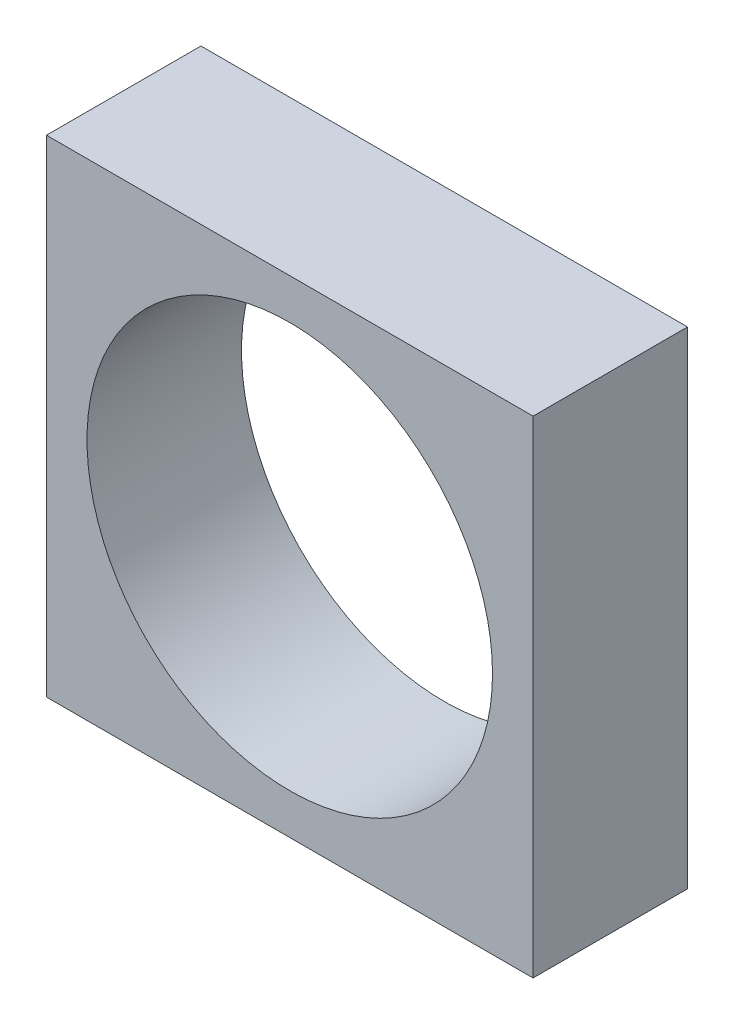
ISO-10303-21;
HEADER;
FILE_DESCRIPTION(('STEP AP214'),'2;1');
FILE_NAME('part.step','',(''),(''),'','','');
FILE_SCHEMA(('AUTOMOTIVE_DESIGN { 1 0 10303 214 1 1 1 1 }'));
ENDSEC;
DATA;
#1=APPLICATION_CONTEXT('core data for automotive mechanical design processes');
#2=APPLICATION_PROTOCOL_DEFINITION('international standard','automotive_design',2000,#1);
#3=PRODUCT_CONTEXT('',#1,'mechanical');
#4=PRODUCT('Part','Part','',(#3));
#5=PRODUCT_RELATED_PRODUCT_CATEGORY('part','',(#4));
#6=PRODUCT_DEFINITION_FORMATION('','',#4);
#7=PRODUCT_DEFINITION_CONTEXT('part definition',#1,'design');
#8=PRODUCT_DEFINITION('design','',#6,#7);
#9=PRODUCT_DEFINITION_SHAPE('','',#8);
#10=(LENGTH_UNIT() NAMED_UNIT(*) SI_UNIT(.MILLI.,.METRE.));
#11=(NAMED_UNIT(*) PLANE_ANGLE_UNIT() SI_UNIT($,.RADIAN.));
#12=(NAMED_UNIT(*) SI_UNIT($,.STERADIAN.) SOLID_ANGLE_UNIT());
#13=UNCERTAINTY_MEASURE_WITH_UNIT(LENGTH_MEASURE(1.E-05),#10,'distance_accuracy_value','');
#14=(GEOMETRIC_REPRESENTATION_CONTEXT(3) GLOBAL_UNCERTAINTY_ASSIGNED_CONTEXT((#13)) GLOBAL_UNIT_ASSIGNED_CONTEXT((#10,
#11,#12)) REPRESENTATION_CONTEXT('',''));
#15=CARTESIAN_POINT('',(0.,0.,0.));
#16=DIRECTION('',(0.,0.,1.));
#17=DIRECTION('',(1.,0.,0.));
#18=AXIS2_PLACEMENT_3D('',#15,#16,#17);
#19=CARTESIAN_POINT('',(0.,0.,19.05));
#20=DIRECTION('',(1.,0.,0.));
#21=DIRECTION('',(0.,0.,-1.));
#22=AXIS2_PLACEMENT_3D('',#19,#20,#21);
#23=PLANE('',#22);
#24=DIRECTION('',(0.,-1.,0.));
#25=VECTOR('',#24,1.);
#26=CARTESIAN_POINT('',(0.,0.,0.));
#27=LINE('',#26,#25);
#28=CARTESIAN_POINT('',(0.,60.,0.));
#29=VERTEX_POINT('',#28);
#30=CARTESIAN_POINT('',(0.,0.,0.));
#31=VERTEX_POINT('',#30);
#32=EDGE_CURVE('E95',#29,#31,#27,.T.);
#33=ORIENTED_EDGE('',*,*,#32,.T.);
#34=DIRECTION('',(0.,0.,-1.));
#35=VECTOR('',#34,1.);
#36=CARTESIAN_POINT('',(0.,0.,19.05));
#37=LINE('',#36,#35);
#38=CARTESIAN_POINT('',(0.,0.,19.05));
#39=VERTEX_POINT('',#38);
#40=EDGE_CURVE('E11',#39,#31,#37,.T.);
#41=ORIENTED_EDGE('',*,*,#40,.F.);
#42=DIRECTION('',(0.,-1.,0.));
#43=VECTOR('',#42,1.);
#44=CARTESIAN_POINT('',(0.,0.,19.05));
#45=LINE('',#44,#43);
#46=CARTESIAN_POINT('',(0.,60.,19.05));
#47=VERTEX_POINT('',#46);
#48=EDGE_CURVE('E83',#47,#39,#45,.T.);
#49=ORIENTED_EDGE('',*,*,#48,.F.);
#50=DIRECTION('',(0.,0.,-1.));
#51=VECTOR('',#50,1.);
#52=CARTESIAN_POINT('',(0.,60.,19.05));
#53=LINE('',#52,#51);
#54=EDGE_CURVE('E91',#47,#29,#53,.T.);
#55=ORIENTED_EDGE('',*,*,#54,.T.);
#56=EDGE_LOOP('',(#33,#41,#49,#55));
#57=FACE_BOUND('',#56,.T.);
#58=ADVANCED_FACE('F32',(#57),#23,.F.);
#59=CARTESIAN_POINT('',(0.,0.,19.05));
#60=DIRECTION('',(0.,1.,0.));
#61=DIRECTION('',(0.,0.,1.));
#62=AXIS2_PLACEMENT_3D('',#59,#60,#61);
#63=PLANE('',#62);
#64=DIRECTION('',(1.,0.,0.));
#65=VECTOR('',#64,1.);
#66=CARTESIAN_POINT('',(0.,0.,0.));
#67=LINE('',#66,#65);
#68=CARTESIAN_POINT('',(60.,0.,0.));
#69=VERTEX_POINT('',#68);
#70=EDGE_CURVE('E87',#31,#69,#67,.T.);
#71=ORIENTED_EDGE('',*,*,#70,.T.);
#72=DIRECTION('',(0.,0.,-1.));
#73=VECTOR('',#72,1.);
#74=CARTESIAN_POINT('',(60.,0.,19.05));
#75=LINE('',#74,#73);
#76=CARTESIAN_POINT('',(60.,0.,19.05));
#77=VERTEX_POINT('',#76);
#78=EDGE_CURVE('E40',#77,#69,#75,.T.);
#79=ORIENTED_EDGE('',*,*,#78,.F.);
#80=DIRECTION('',(1.,0.,0.));
#81=VECTOR('',#80,1.);
#82=CARTESIAN_POINT('',(0.,0.,19.05));
#83=LINE('',#82,#81);
#84=EDGE_CURVE('E78',#39,#77,#83,.T.);
#85=ORIENTED_EDGE('',*,*,#84,.F.);
#86=ORIENTED_EDGE('',*,*,#40,.T.);
#87=EDGE_LOOP('',(#71,#79,#85,#86));
#88=FACE_BOUND('',#87,.T.);
#89=ADVANCED_FACE('F86',(#88),#63,.F.);
#90=CARTESIAN_POINT('',(60.,0.,19.05));
#91=DIRECTION('',(-1.,0.,0.));
#92=DIRECTION('',(0.,0.,1.));
#93=AXIS2_PLACEMENT_3D('',#90,#91,#92);
#94=PLANE('',#93);
#95=DIRECTION('',(0.,1.,0.));
#96=VECTOR('',#95,1.);
#97=CARTESIAN_POINT('',(60.,0.,0.));
#98=LINE('',#97,#96);
#99=CARTESIAN_POINT('',(60.,60.,0.));
#100=VERTEX_POINT('',#99);
#101=EDGE_CURVE('E65',#69,#100,#98,.T.);
#102=ORIENTED_EDGE('',*,*,#101,.T.);
#103=DIRECTION('',(0.,0.,-1.));
#104=VECTOR('',#103,1.);
#105=CARTESIAN_POINT('',(60.,60.,19.05));
#106=LINE('',#105,#104);
#107=CARTESIAN_POINT('',(60.,60.,19.05));
#108=VERTEX_POINT('',#107);
#109=EDGE_CURVE('E88',#108,#100,#106,.T.);
#110=ORIENTED_EDGE('',*,*,#109,.F.);
#111=DIRECTION('',(0.,1.,0.));
#112=VECTOR('',#111,1.);
#113=CARTESIAN_POINT('',(60.,0.,19.05));
#114=LINE('',#113,#112);
#115=EDGE_CURVE('E81',#77,#108,#114,.T.);
#116=ORIENTED_EDGE('',*,*,#115,.F.);
#117=ORIENTED_EDGE('',*,*,#78,.T.);
#118=EDGE_LOOP('',(#102,#110,#116,#117));
#119=FACE_BOUND('',#118,.T.);
#120=ADVANCED_FACE('F89',(#119),#94,.F.);
#121=CARTESIAN_POINT('',(0.,60.,19.05));
#122=DIRECTION('',(0.,-1.,0.));
#123=DIRECTION('',(0.,0.,-1.));
#124=AXIS2_PLACEMENT_3D('',#121,#122,#123);
#125=PLANE('',#124);
#126=DIRECTION('',(-1.,0.,0.));
#127=VECTOR('',#126,1.);
#128=CARTESIAN_POINT('',(0.,60.,0.));
#129=LINE('',#128,#127);
#130=EDGE_CURVE('E71',#100,#29,#129,.T.);
#131=ORIENTED_EDGE('',*,*,#130,.T.);
#132=ORIENTED_EDGE('',*,*,#54,.F.);
#133=DIRECTION('',(-1.,0.,0.));
#134=VECTOR('',#133,1.);
#135=CARTESIAN_POINT('',(0.,60.,19.05));
#136=LINE('',#135,#134);
#137=EDGE_CURVE('E48',#108,#47,#136,.T.);
#138=ORIENTED_EDGE('',*,*,#137,.F.);
#139=ORIENTED_EDGE('',*,*,#109,.T.);
#140=EDGE_LOOP('',(#131,#132,#138,#139));
#141=FACE_BOUND('',#140,.T.);
#142=ADVANCED_FACE('F103',(#141),#125,.F.);
#143=CARTESIAN_POINT('',(0.,60.,19.05));
#144=DIRECTION('',(0.,0.,-1.));
#145=DIRECTION('',(-1.,0.,0.));
#146=AXIS2_PLACEMENT_3D('',#143,#144,#145);
#147=PLANE('',#146);
#148=CARTESIAN_POINT('',(30.,30.,19.05));
#149=DIRECTION('',(0.,0.,1.));
#150=DIRECTION('',(1.,0.,0.));
#151=AXIS2_PLACEMENT_3D('',#148,#149,#150);
#152=CIRCLE('',#151,25.);
#153=CARTESIAN_POINT('',(55.,30.,19.05));
#154=VERTEX_POINT('',#153);
#155=EDGE_CURVE('E109',#154,#154,#152,.T.);
#156=ORIENTED_EDGE('',*,*,#155,.F.);
#157=EDGE_LOOP('',(#156));
#158=FACE_BOUND('',#157,.T.);
#159=ORIENTED_EDGE('',*,*,#48,.T.);
#160=ORIENTED_EDGE('',*,*,#84,.T.);
#161=ORIENTED_EDGE('',*,*,#115,.T.);
#162=ORIENTED_EDGE('',*,*,#137,.T.);
#163=EDGE_LOOP('',(#159,#160,#161,#162));
#164=FACE_BOUND('',#163,.T.);
#165=ADVANCED_FACE('F79',(#158,#164),#147,.F.);
#166=CARTESIAN_POINT('',(0.,60.,0.));
#167=DIRECTION('',(0.,0.,-1.));
#168=DIRECTION('',(-1.,0.,0.));
#169=AXIS2_PLACEMENT_3D('',#166,#167,#168);
#170=PLANE('',#169);
#171=CARTESIAN_POINT('',(30.,30.,0.));
#172=DIRECTION('',(0.,0.,1.));
#173=DIRECTION('',(1.,0.,0.));
#174=AXIS2_PLACEMENT_3D('',#171,#172,#173);
#175=CIRCLE('',#174,25.);
#176=CARTESIAN_POINT('',(55.,30.,0.));
#177=VERTEX_POINT('',#176);
#178=EDGE_CURVE('E98',#177,#177,#175,.T.);
#179=ORIENTED_EDGE('',*,*,#178,.T.);
#180=EDGE_LOOP('',(#179));
#181=FACE_BOUND('',#180,.T.);
#182=ORIENTED_EDGE('',*,*,#32,.F.);
#183=ORIENTED_EDGE('',*,*,#130,.F.);
#184=ORIENTED_EDGE('',*,*,#101,.F.);
#185=ORIENTED_EDGE('',*,*,#70,.F.);
#186=EDGE_LOOP('',(#182,#183,#184,#185));
#187=FACE_BOUND('',#186,.T.);
#188=ADVANCED_FACE('F106',(#181,#187),#170,.T.);
#189=CARTESIAN_POINT('',(30.,30.,0.));
#190=DIRECTION('',(0.,0.,1.));
#191=DIRECTION('',(1.,0.,0.));
#192=AXIS2_PLACEMENT_3D('',#189,#190,#191);
#193=CYLINDRICAL_SURFACE('',#192,25.);
#194=CARTESIAN_POINT('',(55.,30.,0.));
#195=CARTESIAN_POINT('',(55.,30.,0.1984375));
#196=CARTESIAN_POINT('',(55.,30.,0.396875));
#197=CARTESIAN_POINT('',(55.,30.,0.79375));
#198=CARTESIAN_POINT('',(55.,30.,0.9921875));
#199=CARTESIAN_POINT('',(55.,30.,1.3890625));
#200=CARTESIAN_POINT('',(55.,30.,1.5875));
#201=CARTESIAN_POINT('',(55.,30.,1.984375));
#202=CARTESIAN_POINT('',(55.,30.,2.1828125));
#203=CARTESIAN_POINT('',(55.,30.,2.5796875));
#204=CARTESIAN_POINT('',(55.,30.,2.778125));
#205=CARTESIAN_POINT('',(55.,30.,3.175));
#206=CARTESIAN_POINT('',(55.,30.,3.3734375));
#207=CARTESIAN_POINT('',(55.,30.,3.7703125));
#208=CARTESIAN_POINT('',(55.,30.,3.96875));
#209=CARTESIAN_POINT('',(55.,30.,4.365625));
#210=CARTESIAN_POINT('',(55.,30.,4.5640625));
#211=CARTESIAN_POINT('',(55.,30.,4.9609375));
#212=CARTESIAN_POINT('',(55.,30.,5.159375));
#213=CARTESIAN_POINT('',(55.,30.,5.55625));
#214=CARTESIAN_POINT('',(55.,30.,5.7546875));
#215=CARTESIAN_POINT('',(55.,30.,6.1515625));
#216=CARTESIAN_POINT('',(55.,30.,6.35));
#217=CARTESIAN_POINT('',(55.,30.,6.746875));
#218=CARTESIAN_POINT('',(55.,30.,6.9453125));
#219=CARTESIAN_POINT('',(55.,30.,7.3421875));
#220=CARTESIAN_POINT('',(55.,30.,7.540625));
#221=CARTESIAN_POINT('',(55.,30.,7.9375));
#222=CARTESIAN_POINT('',(55.,30.,8.1359375));
#223=CARTESIAN_POINT('',(55.,30.,8.5328125));
#224=CARTESIAN_POINT('',(55.,30.,8.73125));
#225=CARTESIAN_POINT('',(55.,30.,9.128125));
#226=CARTESIAN_POINT('',(55.,30.,9.3265625));
#227=CARTESIAN_POINT('',(55.,30.,9.7234375));
#228=CARTESIAN_POINT('',(55.,30.,9.921875));
#229=CARTESIAN_POINT('',(55.,30.,10.31875));
#230=CARTESIAN_POINT('',(55.,30.,10.5171875));
#231=CARTESIAN_POINT('',(55.,30.,10.9140625));
#232=CARTESIAN_POINT('',(55.,30.,11.1125));
#233=CARTESIAN_POINT('',(55.,30.,11.509375));
#234=CARTESIAN_POINT('',(55.,30.,11.7078125));
#235=CARTESIAN_POINT('',(55.,30.,12.1046875));
#236=CARTESIAN_POINT('',(55.,30.,12.303125));
#237=CARTESIAN_POINT('',(55.,30.,12.7));
#238=CARTESIAN_POINT('',(55.,30.,12.8984375));
#239=CARTESIAN_POINT('',(55.,30.,13.2953125));
#240=CARTESIAN_POINT('',(55.,30.,13.49375));
#241=CARTESIAN_POINT('',(55.,30.,13.890625));
#242=CARTESIAN_POINT('',(55.,30.,14.0890625));
#243=CARTESIAN_POINT('',(55.,30.,14.4859375));
#244=CARTESIAN_POINT('',(55.,30.,14.684375));
#245=CARTESIAN_POINT('',(55.,30.,15.08125));
#246=CARTESIAN_POINT('',(55.,30.,15.2796875));
#247=CARTESIAN_POINT('',(55.,30.,15.6765625));
#248=CARTESIAN_POINT('',(55.,30.,15.875));
#249=CARTESIAN_POINT('',(55.,30.,16.271875));
#250=CARTESIAN_POINT('',(55.,30.,16.4703125));
#251=CARTESIAN_POINT('',(55.,30.,16.8671875));
#252=CARTESIAN_POINT('',(55.,30.,17.065625));
#253=CARTESIAN_POINT('',(55.,30.,17.4625));
#254=CARTESIAN_POINT('',(55.,30.,17.6609375));
#255=CARTESIAN_POINT('',(55.,30.,18.0578125));
#256=CARTESIAN_POINT('',(55.,30.,18.25625));
#257=CARTESIAN_POINT('',(55.,30.,18.653125));
#258=CARTESIAN_POINT('',(55.,30.,18.8515625));
#259=CARTESIAN_POINT('',(55.,30.,19.05));
#260=B_SPLINE_CURVE_WITH_KNOTS('',3,(#194,#195,#196,#197,#198,#199,#200,#201,#202,#203,#204,
#205,#206,#207,#208,#209,#210,#211,#212,#213,#214,#215,#216,#217,#218,#219,#220,#221,#222,#223,
#224,#225,#226,#227,#228,#229,#230,#231,#232,#233,#234,#235,#236,#237,#238,#239,#240,#241,#242,
#243,#244,#245,#246,#247,#248,#249,#250,#251,#252,#253,#254,#255,#256,#257,#258,#259),
.UNSPECIFIED.,.F.,.F.,(4,2,2,2,2,2,2,2,2,2,2,2,2,2,2,2,2,2,2,2,2,2,2,2,2,2,2,2,2,2,2,2,4),(0.,
0.5953125,1.190625,1.7859375,2.38125,2.9765625,3.571875,4.1671875,4.7625,5.3578125,5.953125,
6.5484375,7.14375,7.7390625,8.334375,8.9296875,9.525,10.1203125,10.715625,11.3109375,11.90625,
12.5015625,13.096875,13.6921875,14.2875,14.8828125,15.478125,16.0734375,16.66875,17.2640625,
17.859375,18.4546875,19.05),.UNSPECIFIED.);
#261=EDGE_CURVE('BSEAM116',#177,#154,#260,.T.);
#262=ORIENTED_EDGE('',*,*,#178,.F.);
#263=ORIENTED_EDGE('',*,*,#155,.T.);
#264=ORIENTED_EDGE('',*,*,#261,.T.);
#265=ORIENTED_EDGE('',*,*,#261,.F.);
#266=EDGE_LOOP('',(#262,#264,#263,#265));
#267=FACE_BOUND('',#266,.T.);
#268=ADVANCED_FACE('F116',(#267),#193,.F.);
#269=CLOSED_SHELL('',(#58,#89,#120,#142,#165,#188,#268));
#270=MANIFOLD_SOLID_BREP('B2',#269);
#271=ADVANCED_BREP_SHAPE_REPRESENTATION('',(#18,#270),#14);
#272=SHAPE_DEFINITION_REPRESENTATION(#9,#271);
ENDSEC;
END-ISO-10303-21;
